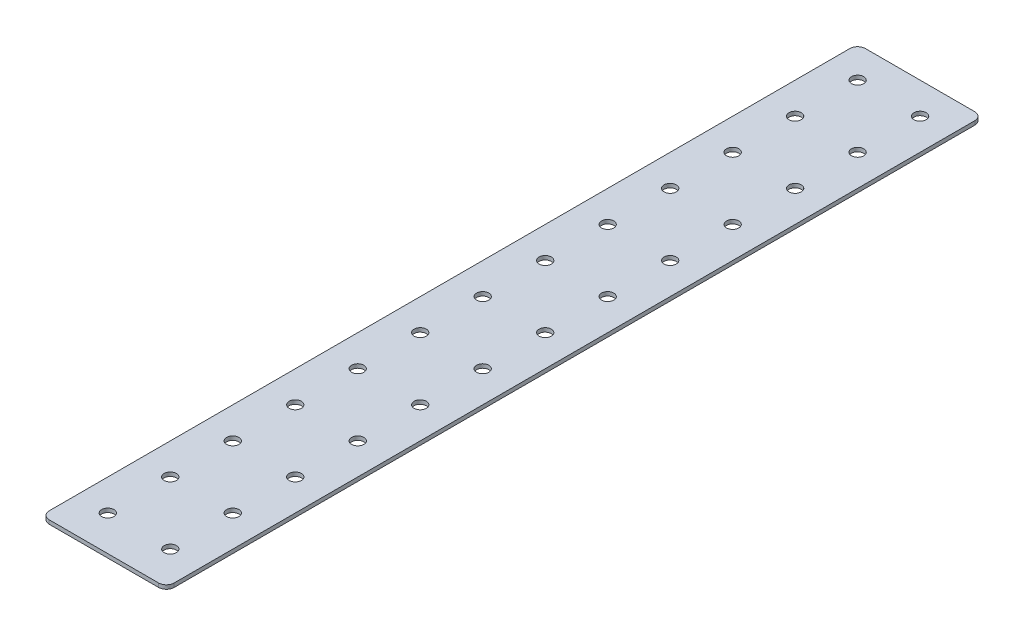
ISO-10303-21;
HEADER;
FILE_DESCRIPTION(('STEP AP214'),'2;1');
FILE_NAME('part.step','',(''),(''),'','','');
FILE_SCHEMA(('AUTOMOTIVE_DESIGN { 1 0 10303 214 1 1 1 1 }'));
ENDSEC;
DATA;
#1=APPLICATION_CONTEXT('core data for automotive mechanical design processes');
#2=APPLICATION_PROTOCOL_DEFINITION('international standard','automotive_design',2000,#1);
#3=PRODUCT_CONTEXT('',#1,'mechanical');
#4=PRODUCT('Part','Part','',(#3));
#5=PRODUCT_RELATED_PRODUCT_CATEGORY('part','',(#4));
#6=PRODUCT_DEFINITION_FORMATION('','',#4);
#7=PRODUCT_DEFINITION_CONTEXT('part definition',#1,'design');
#8=PRODUCT_DEFINITION('design','',#6,#7);
#9=PRODUCT_DEFINITION_SHAPE('','',#8);
#10=(LENGTH_UNIT() NAMED_UNIT(*) SI_UNIT(.MILLI.,.METRE.));
#11=(NAMED_UNIT(*) PLANE_ANGLE_UNIT() SI_UNIT($,.RADIAN.));
#12=(NAMED_UNIT(*) SI_UNIT($,.STERADIAN.) SOLID_ANGLE_UNIT());
#13=UNCERTAINTY_MEASURE_WITH_UNIT(LENGTH_MEASURE(1.E-05),#10,'distance_accuracy_value','');
#14=(GEOMETRIC_REPRESENTATION_CONTEXT(3) GLOBAL_UNCERTAINTY_ASSIGNED_CONTEXT((#13)) GLOBAL_UNIT_ASSIGNED_CONTEXT((#10,
#11,#12)) REPRESENTATION_CONTEXT('',''));
#15=CARTESIAN_POINT('',(0.,0.,0.));
#16=DIRECTION('',(0.,0.,1.));
#17=DIRECTION('',(1.,0.,0.));
#18=AXIS2_PLACEMENT_3D('',#15,#16,#17);
#19=CARTESIAN_POINT('',(0.,1.5875,0.));
#20=DIRECTION('',(0.,-1.,0.));
#21=DIRECTION('',(0.,0.,-1.));
#22=AXIS2_PLACEMENT_3D('',#19,#20,#21);
#23=PLANE('',#22);
#24=DIRECTION('',(-1.,0.,0.));
#25=VECTOR('',#24,1.);
#26=CARTESIAN_POINT('',(0.,1.5875,-331.7875));
#27=LINE('',#26,#25);
#28=CARTESIAN_POINT('',(47.625,1.5875,-331.7875));
#29=VERTEX_POINT('',#28);
#30=CARTESIAN_POINT('',(3.175,1.5875,-331.7875));
#31=VERTEX_POINT('',#30);
#32=EDGE_CURVE('E144',#29,#31,#27,.T.);
#33=ORIENTED_EDGE('',*,*,#32,.T.);
#34=CARTESIAN_POINT('',(3.175,1.5875,-328.6125));
#35=DIRECTION('',(0.,-1.,0.));
#36=DIRECTION('',(0.,0.,-1.));
#37=AXIS2_PLACEMENT_3D('',#34,#35,#36);
#38=CIRCLE('',#37,3.175);
#39=CARTESIAN_POINT('',(0.,1.5875,-328.6125));
#40=VERTEX_POINT('',#39);
#41=EDGE_CURVE('E162',#31,#40,#38,.F.);
#42=ORIENTED_EDGE('',*,*,#41,.T.);
#43=DIRECTION('',(0.,0.,1.));
#44=VECTOR('',#43,1.);
#45=CARTESIAN_POINT('',(0.,1.5875,0.));
#46=LINE('',#45,#44);
#47=CARTESIAN_POINT('',(0.,1.5875,-3.175));
#48=VERTEX_POINT('',#47);
#49=EDGE_CURVE('E126',#40,#48,#46,.T.);
#50=ORIENTED_EDGE('',*,*,#49,.T.);
#51=CARTESIAN_POINT('',(3.175,1.5875,-3.175));
#52=DIRECTION('',(0.,-1.,0.));
#53=DIRECTION('',(0.,0.,-1.));
#54=AXIS2_PLACEMENT_3D('',#51,#52,#53);
#55=CIRCLE('',#54,3.175);
#56=CARTESIAN_POINT('',(3.175,1.5875,0.));
#57=VERTEX_POINT('',#56);
#58=EDGE_CURVE('E158',#48,#57,#55,.F.);
#59=ORIENTED_EDGE('',*,*,#58,.T.);
#60=DIRECTION('',(1.,0.,0.));
#61=VECTOR('',#60,1.);
#62=CARTESIAN_POINT('',(0.,1.5875,0.));
#63=LINE('',#62,#61);
#64=CARTESIAN_POINT('',(47.625,1.5875,0.));
#65=VERTEX_POINT('',#64);
#66=EDGE_CURVE('E171',#57,#65,#63,.T.);
#67=ORIENTED_EDGE('',*,*,#66,.T.);
#68=CARTESIAN_POINT('',(47.625,1.5875,-3.175));
#69=DIRECTION('',(0.,-1.,0.));
#70=DIRECTION('',(0.,0.,-1.));
#71=AXIS2_PLACEMENT_3D('',#68,#69,#70);
#72=CIRCLE('',#71,3.175);
#73=CARTESIAN_POINT('',(50.8,1.5875,-3.175));
#74=VERTEX_POINT('',#73);
#75=EDGE_CURVE('E61',#65,#74,#72,.F.);
#76=ORIENTED_EDGE('',*,*,#75,.T.);
#77=DIRECTION('',(0.,0.,-1.));
#78=VECTOR('',#77,1.);
#79=CARTESIAN_POINT('',(50.8,1.5875,0.));
#80=LINE('',#79,#78);
#81=CARTESIAN_POINT('',(50.8,1.5875,-328.6125));
#82=VERTEX_POINT('',#81);
#83=EDGE_CURVE('E177',#74,#82,#80,.T.);
#84=ORIENTED_EDGE('',*,*,#83,.T.);
#85=CARTESIAN_POINT('',(47.625,1.5875,-328.6125));
#86=DIRECTION('',(0.,-1.,0.));
#87=DIRECTION('',(0.,0.,-1.));
#88=AXIS2_PLACEMENT_3D('',#85,#86,#87);
#89=CIRCLE('',#88,3.175);
#90=EDGE_CURVE('E160',#82,#29,#89,.F.);
#91=ORIENTED_EDGE('',*,*,#90,.T.);
#92=EDGE_LOOP('',(#33,#42,#50,#59,#67,#76,#84,#91));
#93=FACE_BOUND('',#92,.T.);
#94=CARTESIAN_POINT('',(12.7,1.5875,-14.2875));
#95=DIRECTION('',(0.,1.,0.));
#96=DIRECTION('',(0.,0.,1.));
#97=AXIS2_PLACEMENT_3D('',#94,#95,#96);
#98=CIRCLE('',#97,2.4892);
#99=CARTESIAN_POINT('',(12.7,1.5875,-11.7983));
#100=VERTEX_POINT('',#99);
#101=EDGE_CURVE('E135',#100,#100,#98,.T.);
#102=ORIENTED_EDGE('',*,*,#101,.F.);
#103=EDGE_LOOP('',(#102));
#104=FACE_BOUND('',#103,.T.);
#105=CARTESIAN_POINT('',(12.7,1.5875,-166.6875));
#106=DIRECTION('',(0.,1.,0.));
#107=DIRECTION('',(0.,0.,1.));
#108=AXIS2_PLACEMENT_3D('',#105,#106,#107);
#109=CIRCLE('',#108,2.48920000000001);
#110=CARTESIAN_POINT('',(12.7,1.5875,-164.1983));
#111=VERTEX_POINT('',#110);
#112=EDGE_CURVE('E192',#111,#111,#109,.T.);
#113=ORIENTED_EDGE('',*,*,#112,.F.);
#114=EDGE_LOOP('',(#113));
#115=FACE_BOUND('',#114,.T.);
#116=CARTESIAN_POINT('',(12.7,1.5875,-39.6875));
#117=DIRECTION('',(0.,1.,0.));
#118=DIRECTION('',(0.,0.,1.));
#119=AXIS2_PLACEMENT_3D('',#116,#117,#118);
#120=CIRCLE('',#119,2.4892);
#121=CARTESIAN_POINT('',(12.7,1.5875,-37.1983));
#122=VERTEX_POINT('',#121);
#123=EDGE_CURVE('E197',#122,#122,#120,.T.);
#124=ORIENTED_EDGE('',*,*,#123,.F.);
#125=EDGE_LOOP('',(#124));
#126=FACE_BOUND('',#125,.T.);
#127=CARTESIAN_POINT('',(12.7,1.5875,-65.0875));
#128=DIRECTION('',(0.,1.,0.));
#129=DIRECTION('',(0.,0.,1.));
#130=AXIS2_PLACEMENT_3D('',#127,#128,#129);
#131=CIRCLE('',#130,2.4892);
#132=CARTESIAN_POINT('',(12.7,1.5875,-62.5983));
#133=VERTEX_POINT('',#132);
#134=EDGE_CURVE('E203',#133,#133,#131,.T.);
#135=ORIENTED_EDGE('',*,*,#134,.F.);
#136=EDGE_LOOP('',(#135));
#137=FACE_BOUND('',#136,.T.);
#138=CARTESIAN_POINT('',(12.7,1.5875,-90.4875));
#139=DIRECTION('',(0.,1.,0.));
#140=DIRECTION('',(0.,0.,1.));
#141=AXIS2_PLACEMENT_3D('',#138,#139,#140);
#142=CIRCLE('',#141,2.48919999999999);
#143=CARTESIAN_POINT('',(12.7,1.5875,-87.9983));
#144=VERTEX_POINT('',#143);
#145=EDGE_CURVE('E209',#144,#144,#142,.T.);
#146=ORIENTED_EDGE('',*,*,#145,.F.);
#147=EDGE_LOOP('',(#146));
#148=FACE_BOUND('',#147,.T.);
#149=CARTESIAN_POINT('',(12.7,1.5875,-115.8875));
#150=DIRECTION('',(0.,1.,0.));
#151=DIRECTION('',(0.,0.,1.));
#152=AXIS2_PLACEMENT_3D('',#149,#150,#151);
#153=CIRCLE('',#152,2.48919999999999);
#154=CARTESIAN_POINT('',(12.7,1.5875,-113.3983));
#155=VERTEX_POINT('',#154);
#156=EDGE_CURVE('E215',#155,#155,#153,.T.);
#157=ORIENTED_EDGE('',*,*,#156,.F.);
#158=EDGE_LOOP('',(#157));
#159=FACE_BOUND('',#158,.T.);
#160=CARTESIAN_POINT('',(12.7,1.5875,-141.2875));
#161=DIRECTION('',(0.,1.,0.));
#162=DIRECTION('',(0.,0.,1.));
#163=AXIS2_PLACEMENT_3D('',#160,#161,#162);
#164=CIRCLE('',#163,2.48920000000001);
#165=CARTESIAN_POINT('',(12.7,1.5875,-138.7983));
#166=VERTEX_POINT('',#165);
#167=EDGE_CURVE('E221',#166,#166,#164,.T.);
#168=ORIENTED_EDGE('',*,*,#167,.F.);
#169=EDGE_LOOP('',(#168));
#170=FACE_BOUND('',#169,.T.);
#171=CARTESIAN_POINT('',(38.1,1.5875,-39.6875));
#172=DIRECTION('',(0.,1.,0.));
#173=DIRECTION('',(0.,0.,1.));
#174=AXIS2_PLACEMENT_3D('',#171,#172,#173);
#175=CIRCLE('',#174,2.4892);
#176=CARTESIAN_POINT('',(38.1,1.5875,-37.1983));
#177=VERTEX_POINT('',#176);
#178=EDGE_CURVE('E227',#177,#177,#175,.T.);
#179=ORIENTED_EDGE('',*,*,#178,.F.);
#180=EDGE_LOOP('',(#179));
#181=FACE_BOUND('',#180,.T.);
#182=CARTESIAN_POINT('',(38.1,1.5875,-65.0875));
#183=DIRECTION('',(0.,1.,0.));
#184=DIRECTION('',(0.,0.,1.));
#185=AXIS2_PLACEMENT_3D('',#182,#183,#184);
#186=CIRCLE('',#185,2.4892);
#187=CARTESIAN_POINT('',(38.1,1.5875,-62.5983));
#188=VERTEX_POINT('',#187);
#189=EDGE_CURVE('E233',#188,#188,#186,.T.);
#190=ORIENTED_EDGE('',*,*,#189,.F.);
#191=EDGE_LOOP('',(#190));
#192=FACE_BOUND('',#191,.T.);
#193=CARTESIAN_POINT('',(38.1,1.5875,-90.4875));
#194=DIRECTION('',(0.,1.,0.));
#195=DIRECTION('',(0.,0.,1.));
#196=AXIS2_PLACEMENT_3D('',#193,#194,#195);
#197=CIRCLE('',#196,2.4892);
#198=CARTESIAN_POINT('',(38.1,1.5875,-87.9983));
#199=VERTEX_POINT('',#198);
#200=EDGE_CURVE('E239',#199,#199,#197,.T.);
#201=ORIENTED_EDGE('',*,*,#200,.F.);
#202=EDGE_LOOP('',(#201));
#203=FACE_BOUND('',#202,.T.);
#204=CARTESIAN_POINT('',(38.1,1.5875,-115.8875));
#205=DIRECTION('',(0.,1.,0.));
#206=DIRECTION('',(0.,0.,1.));
#207=AXIS2_PLACEMENT_3D('',#204,#205,#206);
#208=CIRCLE('',#207,2.4892);
#209=CARTESIAN_POINT('',(38.1,1.5875,-113.3983));
#210=VERTEX_POINT('',#209);
#211=EDGE_CURVE('E245',#210,#210,#208,.T.);
#212=ORIENTED_EDGE('',*,*,#211,.F.);
#213=EDGE_LOOP('',(#212));
#214=FACE_BOUND('',#213,.T.);
#215=CARTESIAN_POINT('',(38.1,1.5875,-141.2875));
#216=DIRECTION('',(0.,1.,0.));
#217=DIRECTION('',(0.,0.,1.));
#218=AXIS2_PLACEMENT_3D('',#215,#216,#217);
#219=CIRCLE('',#218,2.48920000000001);
#220=CARTESIAN_POINT('',(38.1,1.5875,-138.7983));
#221=VERTEX_POINT('',#220);
#222=EDGE_CURVE('E251',#221,#221,#219,.T.);
#223=ORIENTED_EDGE('',*,*,#222,.F.);
#224=EDGE_LOOP('',(#223));
#225=FACE_BOUND('',#224,.T.);
#226=CARTESIAN_POINT('',(38.1,1.5875,-14.2875));
#227=DIRECTION('',(0.,1.,0.));
#228=DIRECTION('',(0.,0.,1.));
#229=AXIS2_PLACEMENT_3D('',#226,#227,#228);
#230=CIRCLE('',#229,2.4892);
#231=CARTESIAN_POINT('',(38.1,1.5875,-11.7983));
#232=VERTEX_POINT('',#231);
#233=EDGE_CURVE('E257',#232,#232,#230,.T.);
#234=ORIENTED_EDGE('',*,*,#233,.F.);
#235=EDGE_LOOP('',(#234));
#236=FACE_BOUND('',#235,.T.);
#237=CARTESIAN_POINT('',(12.7,1.5875,-319.0875));
#238=DIRECTION('',(0.,1.,0.));
#239=DIRECTION('',(0.,0.,1.));
#240=AXIS2_PLACEMENT_3D('',#237,#238,#239);
#241=CIRCLE('',#240,2.48920000000001);
#242=CARTESIAN_POINT('',(12.7,1.5875,-316.5983));
#243=VERTEX_POINT('',#242);
#244=EDGE_CURVE('E263',#243,#243,#241,.T.);
#245=ORIENTED_EDGE('',*,*,#244,.F.);
#246=EDGE_LOOP('',(#245));
#247=FACE_BOUND('',#246,.T.);
#248=CARTESIAN_POINT('',(38.1,1.5875,-166.6875));
#249=DIRECTION('',(0.,1.,0.));
#250=DIRECTION('',(0.,0.,1.));
#251=AXIS2_PLACEMENT_3D('',#248,#249,#250);
#252=CIRCLE('',#251,2.48920000000001);
#253=CARTESIAN_POINT('',(38.1,1.5875,-164.1983));
#254=VERTEX_POINT('',#253);
#255=EDGE_CURVE('E269',#254,#254,#252,.T.);
#256=ORIENTED_EDGE('',*,*,#255,.F.);
#257=EDGE_LOOP('',(#256));
#258=FACE_BOUND('',#257,.T.);
#259=CARTESIAN_POINT('',(38.1,1.5875,-319.0875));
#260=DIRECTION('',(0.,1.,0.));
#261=DIRECTION('',(0.,0.,1.));
#262=AXIS2_PLACEMENT_3D('',#259,#260,#261);
#263=CIRCLE('',#262,2.48920000000001);
#264=CARTESIAN_POINT('',(38.1,1.5875,-316.5983));
#265=VERTEX_POINT('',#264);
#266=EDGE_CURVE('E275',#265,#265,#263,.T.);
#267=ORIENTED_EDGE('',*,*,#266,.F.);
#268=EDGE_LOOP('',(#267));
#269=FACE_BOUND('',#268,.T.);
#270=CARTESIAN_POINT('',(12.7,1.5875,-293.6875));
#271=DIRECTION('',(0.,1.,0.));
#272=DIRECTION('',(0.,0.,1.));
#273=AXIS2_PLACEMENT_3D('',#270,#271,#272);
#274=CIRCLE('',#273,2.48920000000001);
#275=CARTESIAN_POINT('',(12.7,1.5875,-291.1983));
#276=VERTEX_POINT('',#275);
#277=EDGE_CURVE('E281',#276,#276,#274,.T.);
#278=ORIENTED_EDGE('',*,*,#277,.F.);
#279=EDGE_LOOP('',(#278));
#280=FACE_BOUND('',#279,.T.);
#281=CARTESIAN_POINT('',(38.1,1.5875,-293.6875));
#282=DIRECTION('',(0.,1.,0.));
#283=DIRECTION('',(0.,0.,1.));
#284=AXIS2_PLACEMENT_3D('',#281,#282,#283);
#285=CIRCLE('',#284,2.48920000000001);
#286=CARTESIAN_POINT('',(38.1,1.5875,-291.1983));
#287=VERTEX_POINT('',#286);
#288=EDGE_CURVE('E287',#287,#287,#285,.T.);
#289=ORIENTED_EDGE('',*,*,#288,.F.);
#290=EDGE_LOOP('',(#289));
#291=FACE_BOUND('',#290,.T.);
#292=CARTESIAN_POINT('',(12.7,1.5875,-268.2875));
#293=DIRECTION('',(0.,1.,0.));
#294=DIRECTION('',(0.,0.,1.));
#295=AXIS2_PLACEMENT_3D('',#292,#293,#294);
#296=CIRCLE('',#295,2.48920000000001);
#297=CARTESIAN_POINT('',(12.7,1.5875,-265.7983));
#298=VERTEX_POINT('',#297);
#299=EDGE_CURVE('E293',#298,#298,#296,.T.);
#300=ORIENTED_EDGE('',*,*,#299,.F.);
#301=EDGE_LOOP('',(#300));
#302=FACE_BOUND('',#301,.T.);
#303=CARTESIAN_POINT('',(38.1,1.5875,-268.2875));
#304=DIRECTION('',(0.,1.,0.));
#305=DIRECTION('',(0.,0.,1.));
#306=AXIS2_PLACEMENT_3D('',#303,#304,#305);
#307=CIRCLE('',#306,2.48920000000001);
#308=CARTESIAN_POINT('',(38.1,1.5875,-265.7983));
#309=VERTEX_POINT('',#308);
#310=EDGE_CURVE('E299',#309,#309,#307,.T.);
#311=ORIENTED_EDGE('',*,*,#310,.F.);
#312=EDGE_LOOP('',(#311));
#313=FACE_BOUND('',#312,.T.);
#314=CARTESIAN_POINT('',(12.7,1.5875,-242.8875));
#315=DIRECTION('',(0.,1.,0.));
#316=DIRECTION('',(0.,0.,1.));
#317=AXIS2_PLACEMENT_3D('',#314,#315,#316);
#318=CIRCLE('',#317,2.48920000000001);
#319=CARTESIAN_POINT('',(12.7,1.5875,-240.3983));
#320=VERTEX_POINT('',#319);
#321=EDGE_CURVE('E305',#320,#320,#318,.T.);
#322=ORIENTED_EDGE('',*,*,#321,.F.);
#323=EDGE_LOOP('',(#322));
#324=FACE_BOUND('',#323,.T.);
#325=CARTESIAN_POINT('',(38.1,1.5875,-242.8875));
#326=DIRECTION('',(0.,1.,0.));
#327=DIRECTION('',(0.,0.,1.));
#328=AXIS2_PLACEMENT_3D('',#325,#326,#327);
#329=CIRCLE('',#328,2.48920000000001);
#330=CARTESIAN_POINT('',(38.1,1.5875,-240.3983));
#331=VERTEX_POINT('',#330);
#332=EDGE_CURVE('E311',#331,#331,#329,.T.);
#333=ORIENTED_EDGE('',*,*,#332,.F.);
#334=EDGE_LOOP('',(#333));
#335=FACE_BOUND('',#334,.T.);
#336=CARTESIAN_POINT('',(12.7,1.5875,-217.4875));
#337=DIRECTION('',(0.,1.,0.));
#338=DIRECTION('',(0.,0.,1.));
#339=AXIS2_PLACEMENT_3D('',#336,#337,#338);
#340=CIRCLE('',#339,2.48920000000001);
#341=CARTESIAN_POINT('',(12.7,1.5875,-214.9983));
#342=VERTEX_POINT('',#341);
#343=EDGE_CURVE('E317',#342,#342,#340,.T.);
#344=ORIENTED_EDGE('',*,*,#343,.F.);
#345=EDGE_LOOP('',(#344));
#346=FACE_BOUND('',#345,.T.);
#347=CARTESIAN_POINT('',(38.1,1.5875,-217.4875));
#348=DIRECTION('',(0.,1.,0.));
#349=DIRECTION('',(0.,0.,1.));
#350=AXIS2_PLACEMENT_3D('',#347,#348,#349);
#351=CIRCLE('',#350,2.48920000000001);
#352=CARTESIAN_POINT('',(38.1,1.5875,-214.9983));
#353=VERTEX_POINT('',#352);
#354=EDGE_CURVE('E323',#353,#353,#351,.T.);
#355=ORIENTED_EDGE('',*,*,#354,.F.);
#356=EDGE_LOOP('',(#355));
#357=FACE_BOUND('',#356,.T.);
#358=CARTESIAN_POINT('',(12.7,1.5875,-192.0875));
#359=DIRECTION('',(0.,1.,0.));
#360=DIRECTION('',(0.,0.,1.));
#361=AXIS2_PLACEMENT_3D('',#358,#359,#360);
#362=CIRCLE('',#361,2.48920000000001);
#363=CARTESIAN_POINT('',(12.7,1.5875,-189.5983));
#364=VERTEX_POINT('',#363);
#365=EDGE_CURVE('E329',#364,#364,#362,.T.);
#366=ORIENTED_EDGE('',*,*,#365,.F.);
#367=EDGE_LOOP('',(#366));
#368=FACE_BOUND('',#367,.T.);
#369=CARTESIAN_POINT('',(38.1,1.5875,-192.0875));
#370=DIRECTION('',(0.,1.,0.));
#371=DIRECTION('',(0.,0.,1.));
#372=AXIS2_PLACEMENT_3D('',#369,#370,#371);
#373=CIRCLE('',#372,2.48920000000001);
#374=CARTESIAN_POINT('',(38.1,1.5875,-189.5983));
#375=VERTEX_POINT('',#374);
#376=EDGE_CURVE('E335',#375,#375,#373,.T.);
#377=ORIENTED_EDGE('',*,*,#376,.F.);
#378=EDGE_LOOP('',(#377));
#379=FACE_BOUND('',#378,.T.);
#380=ADVANCED_FACE('F39',(#93,#104,#115,#126,#137,#148,#159,#170,#181,#192,#203,#214,#225,#236,
#247,#258,#269,#280,#291,#302,#313,#324,#335,#346,#357,#368,#379),#23,.F.);
#381=CARTESIAN_POINT('',(0.,0.,0.));
#382=DIRECTION('',(0.,-1.,0.));
#383=DIRECTION('',(0.,0.,-1.));
#384=AXIS2_PLACEMENT_3D('',#381,#382,#383);
#385=PLANE('',#384);
#386=CARTESIAN_POINT('',(12.7,0.,-192.0875));
#387=DIRECTION('',(0.,1.,0.));
#388=DIRECTION('',(0.,0.,1.));
#389=AXIS2_PLACEMENT_3D('',#386,#387,#388);
#390=CIRCLE('',#389,2.48920000000001);
#391=CARTESIAN_POINT('',(12.7,0.,-189.5983));
#392=VERTEX_POINT('',#391);
#393=EDGE_CURVE('E332',#392,#392,#390,.T.);
#394=ORIENTED_EDGE('',*,*,#393,.T.);
#395=EDGE_LOOP('',(#394));
#396=FACE_BOUND('',#395,.T.);
#397=CARTESIAN_POINT('',(12.7,0.,-217.4875));
#398=DIRECTION('',(0.,1.,0.));
#399=DIRECTION('',(0.,0.,1.));
#400=AXIS2_PLACEMENT_3D('',#397,#398,#399);
#401=CIRCLE('',#400,2.48920000000001);
#402=CARTESIAN_POINT('',(12.7,0.,-214.9983));
#403=VERTEX_POINT('',#402);
#404=EDGE_CURVE('E320',#403,#403,#401,.T.);
#405=ORIENTED_EDGE('',*,*,#404,.T.);
#406=EDGE_LOOP('',(#405));
#407=FACE_BOUND('',#406,.T.);
#408=CARTESIAN_POINT('',(12.7,0.,-242.8875));
#409=DIRECTION('',(0.,1.,0.));
#410=DIRECTION('',(0.,0.,1.));
#411=AXIS2_PLACEMENT_3D('',#408,#409,#410);
#412=CIRCLE('',#411,2.48920000000001);
#413=CARTESIAN_POINT('',(12.7,0.,-240.3983));
#414=VERTEX_POINT('',#413);
#415=EDGE_CURVE('E308',#414,#414,#412,.T.);
#416=ORIENTED_EDGE('',*,*,#415,.T.);
#417=EDGE_LOOP('',(#416));
#418=FACE_BOUND('',#417,.T.);
#419=CARTESIAN_POINT('',(12.7,0.,-268.2875));
#420=DIRECTION('',(0.,1.,0.));
#421=DIRECTION('',(0.,0.,1.));
#422=AXIS2_PLACEMENT_3D('',#419,#420,#421);
#423=CIRCLE('',#422,2.48920000000001);
#424=CARTESIAN_POINT('',(12.7,0.,-265.7983));
#425=VERTEX_POINT('',#424);
#426=EDGE_CURVE('E296',#425,#425,#423,.T.);
#427=ORIENTED_EDGE('',*,*,#426,.T.);
#428=EDGE_LOOP('',(#427));
#429=FACE_BOUND('',#428,.T.);
#430=CARTESIAN_POINT('',(12.7,0.,-293.6875));
#431=DIRECTION('',(0.,1.,0.));
#432=DIRECTION('',(0.,0.,1.));
#433=AXIS2_PLACEMENT_3D('',#430,#431,#432);
#434=CIRCLE('',#433,2.48920000000001);
#435=CARTESIAN_POINT('',(12.7,0.,-291.1983));
#436=VERTEX_POINT('',#435);
#437=EDGE_CURVE('E284',#436,#436,#434,.T.);
#438=ORIENTED_EDGE('',*,*,#437,.T.);
#439=EDGE_LOOP('',(#438));
#440=FACE_BOUND('',#439,.T.);
#441=CARTESIAN_POINT('',(38.1,0.,-166.6875));
#442=DIRECTION('',(0.,1.,0.));
#443=DIRECTION('',(0.,0.,1.));
#444=AXIS2_PLACEMENT_3D('',#441,#442,#443);
#445=CIRCLE('',#444,2.48920000000001);
#446=CARTESIAN_POINT('',(38.1,0.,-164.1983));
#447=VERTEX_POINT('',#446);
#448=EDGE_CURVE('E272',#447,#447,#445,.T.);
#449=ORIENTED_EDGE('',*,*,#448,.T.);
#450=EDGE_LOOP('',(#449));
#451=FACE_BOUND('',#450,.T.);
#452=CARTESIAN_POINT('',(38.1,0.,-14.2875));
#453=DIRECTION('',(0.,1.,0.));
#454=DIRECTION('',(0.,0.,1.));
#455=AXIS2_PLACEMENT_3D('',#452,#453,#454);
#456=CIRCLE('',#455,2.4892);
#457=CARTESIAN_POINT('',(38.1,0.,-11.7983));
#458=VERTEX_POINT('',#457);
#459=EDGE_CURVE('E260',#458,#458,#456,.T.);
#460=ORIENTED_EDGE('',*,*,#459,.T.);
#461=EDGE_LOOP('',(#460));
#462=FACE_BOUND('',#461,.T.);
#463=CARTESIAN_POINT('',(38.1,0.,-115.8875));
#464=DIRECTION('',(0.,1.,0.));
#465=DIRECTION('',(0.,0.,1.));
#466=AXIS2_PLACEMENT_3D('',#463,#464,#465);
#467=CIRCLE('',#466,2.4892);
#468=CARTESIAN_POINT('',(38.1,0.,-113.3983));
#469=VERTEX_POINT('',#468);
#470=EDGE_CURVE('E248',#469,#469,#467,.T.);
#471=ORIENTED_EDGE('',*,*,#470,.T.);
#472=EDGE_LOOP('',(#471));
#473=FACE_BOUND('',#472,.T.);
#474=CARTESIAN_POINT('',(38.1,0.,-65.0875));
#475=DIRECTION('',(0.,1.,0.));
#476=DIRECTION('',(0.,0.,1.));
#477=AXIS2_PLACEMENT_3D('',#474,#475,#476);
#478=CIRCLE('',#477,2.4892);
#479=CARTESIAN_POINT('',(38.1,0.,-62.5983));
#480=VERTEX_POINT('',#479);
#481=EDGE_CURVE('E236',#480,#480,#478,.T.);
#482=ORIENTED_EDGE('',*,*,#481,.T.);
#483=EDGE_LOOP('',(#482));
#484=FACE_BOUND('',#483,.T.);
#485=CARTESIAN_POINT('',(12.7,0.,-141.2875));
#486=DIRECTION('',(0.,1.,0.));
#487=DIRECTION('',(0.,0.,1.));
#488=AXIS2_PLACEMENT_3D('',#485,#486,#487);
#489=CIRCLE('',#488,2.48920000000001);
#490=CARTESIAN_POINT('',(12.7,0.,-138.7983));
#491=VERTEX_POINT('',#490);
#492=EDGE_CURVE('E224',#491,#491,#489,.T.);
#493=ORIENTED_EDGE('',*,*,#492,.T.);
#494=EDGE_LOOP('',(#493));
#495=FACE_BOUND('',#494,.T.);
#496=CARTESIAN_POINT('',(12.7,0.,-90.4875));
#497=DIRECTION('',(0.,1.,0.));
#498=DIRECTION('',(0.,0.,1.));
#499=AXIS2_PLACEMENT_3D('',#496,#497,#498);
#500=CIRCLE('',#499,2.48919999999999);
#501=CARTESIAN_POINT('',(12.7,0.,-87.9983));
#502=VERTEX_POINT('',#501);
#503=EDGE_CURVE('E212',#502,#502,#500,.T.);
#504=ORIENTED_EDGE('',*,*,#503,.T.);
#505=EDGE_LOOP('',(#504));
#506=FACE_BOUND('',#505,.T.);
#507=CARTESIAN_POINT('',(12.7,0.,-39.6875));
#508=DIRECTION('',(0.,1.,0.));
#509=DIRECTION('',(0.,0.,1.));
#510=AXIS2_PLACEMENT_3D('',#507,#508,#509);
#511=CIRCLE('',#510,2.4892);
#512=CARTESIAN_POINT('',(12.7,0.,-37.1983));
#513=VERTEX_POINT('',#512);
#514=EDGE_CURVE('E200',#513,#513,#511,.T.);
#515=ORIENTED_EDGE('',*,*,#514,.T.);
#516=EDGE_LOOP('',(#515));
#517=FACE_BOUND('',#516,.T.);
#518=CARTESIAN_POINT('',(12.7,0.,-14.2875));
#519=DIRECTION('',(0.,1.,0.));
#520=DIRECTION('',(0.,0.,1.));
#521=AXIS2_PLACEMENT_3D('',#518,#519,#520);
#522=CIRCLE('',#521,2.4892);
#523=CARTESIAN_POINT('',(12.7,0.,-11.7983));
#524=VERTEX_POINT('',#523);
#525=EDGE_CURVE('E141',#524,#524,#522,.T.);
#526=ORIENTED_EDGE('',*,*,#525,.T.);
#527=EDGE_LOOP('',(#526));
#528=FACE_BOUND('',#527,.T.);
#529=DIRECTION('',(0.,0.,1.));
#530=VECTOR('',#529,1.);
#531=CARTESIAN_POINT('',(0.,0.,0.));
#532=LINE('',#531,#530);
#533=CARTESIAN_POINT('',(0.,0.,-328.6125));
#534=VERTEX_POINT('',#533);
#535=CARTESIAN_POINT('',(0.,0.,-3.175));
#536=VERTEX_POINT('',#535);
#537=EDGE_CURVE('E123',#534,#536,#532,.T.);
#538=ORIENTED_EDGE('',*,*,#537,.F.);
#539=CARTESIAN_POINT('',(3.175,0.,-328.6125));
#540=DIRECTION('',(0.,-1.,0.));
#541=DIRECTION('',(0.,0.,-1.));
#542=AXIS2_PLACEMENT_3D('',#539,#540,#541);
#543=CIRCLE('',#542,3.175);
#544=CARTESIAN_POINT('',(3.175,0.,-331.7875));
#545=VERTEX_POINT('',#544);
#546=EDGE_CURVE('E106',#534,#545,#543,.T.);
#547=ORIENTED_EDGE('',*,*,#546,.T.);
#548=DIRECTION('',(-1.,0.,0.));
#549=VECTOR('',#548,1.);
#550=CARTESIAN_POINT('',(0.,0.,-331.7875));
#551=LINE('',#550,#549);
#552=CARTESIAN_POINT('',(47.625,0.,-331.7875));
#553=VERTEX_POINT('',#552);
#554=EDGE_CURVE('E148',#553,#545,#551,.T.);
#555=ORIENTED_EDGE('',*,*,#554,.F.);
#556=CARTESIAN_POINT('',(47.625,0.,-328.6125));
#557=DIRECTION('',(0.,-1.,0.));
#558=DIRECTION('',(0.,0.,-1.));
#559=AXIS2_PLACEMENT_3D('',#556,#557,#558);
#560=CIRCLE('',#559,3.175);
#561=CARTESIAN_POINT('',(50.8,0.,-328.6125));
#562=VERTEX_POINT('',#561);
#563=EDGE_CURVE('E117',#553,#562,#560,.T.);
#564=ORIENTED_EDGE('',*,*,#563,.T.);
#565=DIRECTION('',(0.,0.,-1.));
#566=VECTOR('',#565,1.);
#567=CARTESIAN_POINT('',(50.8,0.,0.));
#568=LINE('',#567,#566);
#569=CARTESIAN_POINT('',(50.8,0.,-3.175));
#570=VERTEX_POINT('',#569);
#571=EDGE_CURVE('E138',#570,#562,#568,.T.);
#572=ORIENTED_EDGE('',*,*,#571,.F.);
#573=CARTESIAN_POINT('',(47.625,0.,-3.175));
#574=DIRECTION('',(0.,-1.,0.));
#575=DIRECTION('',(0.,0.,-1.));
#576=AXIS2_PLACEMENT_3D('',#573,#574,#575);
#577=CIRCLE('',#576,3.175);
#578=CARTESIAN_POINT('',(47.625,0.,0.));
#579=VERTEX_POINT('',#578);
#580=EDGE_CURVE('E127',#570,#579,#577,.T.);
#581=ORIENTED_EDGE('',*,*,#580,.T.);
#582=DIRECTION('',(1.,0.,0.));
#583=VECTOR('',#582,1.);
#584=CARTESIAN_POINT('',(0.,0.,0.));
#585=LINE('',#584,#583);
#586=CARTESIAN_POINT('',(3.175,0.,0.));
#587=VERTEX_POINT('',#586);
#588=EDGE_CURVE('E134',#587,#579,#585,.T.);
#589=ORIENTED_EDGE('',*,*,#588,.F.);
#590=CARTESIAN_POINT('',(3.175,0.,-3.175));
#591=DIRECTION('',(0.,-1.,0.));
#592=DIRECTION('',(0.,0.,-1.));
#593=AXIS2_PLACEMENT_3D('',#590,#591,#592);
#594=CIRCLE('',#593,3.175);
#595=EDGE_CURVE('E133',#587,#536,#594,.T.);
#596=ORIENTED_EDGE('',*,*,#595,.T.);
#597=EDGE_LOOP('',(#538,#547,#555,#564,#572,#581,#589,#596));
#598=FACE_BOUND('',#597,.T.);
#599=CARTESIAN_POINT('',(12.7,0.,-166.6875));
#600=DIRECTION('',(0.,1.,0.));
#601=DIRECTION('',(0.,0.,1.));
#602=AXIS2_PLACEMENT_3D('',#599,#600,#601);
#603=CIRCLE('',#602,2.48920000000001);
#604=CARTESIAN_POINT('',(12.7,0.,-164.1983));
#605=VERTEX_POINT('',#604);
#606=EDGE_CURVE('E194',#605,#605,#603,.T.);
#607=ORIENTED_EDGE('',*,*,#606,.T.);
#608=EDGE_LOOP('',(#607));
#609=FACE_BOUND('',#608,.T.);
#610=CARTESIAN_POINT('',(12.7,0.,-65.0875));
#611=DIRECTION('',(0.,1.,0.));
#612=DIRECTION('',(0.,0.,1.));
#613=AXIS2_PLACEMENT_3D('',#610,#611,#612);
#614=CIRCLE('',#613,2.4892);
#615=CARTESIAN_POINT('',(12.7,0.,-62.5983));
#616=VERTEX_POINT('',#615);
#617=EDGE_CURVE('E206',#616,#616,#614,.T.);
#618=ORIENTED_EDGE('',*,*,#617,.T.);
#619=EDGE_LOOP('',(#618));
#620=FACE_BOUND('',#619,.T.);
#621=CARTESIAN_POINT('',(12.7,0.,-115.8875));
#622=DIRECTION('',(0.,1.,0.));
#623=DIRECTION('',(0.,0.,1.));
#624=AXIS2_PLACEMENT_3D('',#621,#622,#623);
#625=CIRCLE('',#624,2.48919999999999);
#626=CARTESIAN_POINT('',(12.7,0.,-113.3983));
#627=VERTEX_POINT('',#626);
#628=EDGE_CURVE('E218',#627,#627,#625,.T.);
#629=ORIENTED_EDGE('',*,*,#628,.T.);
#630=EDGE_LOOP('',(#629));
#631=FACE_BOUND('',#630,.T.);
#632=CARTESIAN_POINT('',(38.1,0.,-39.6875));
#633=DIRECTION('',(0.,1.,0.));
#634=DIRECTION('',(0.,0.,1.));
#635=AXIS2_PLACEMENT_3D('',#632,#633,#634);
#636=CIRCLE('',#635,2.4892);
#637=CARTESIAN_POINT('',(38.1,0.,-37.1983));
#638=VERTEX_POINT('',#637);
#639=EDGE_CURVE('E230',#638,#638,#636,.T.);
#640=ORIENTED_EDGE('',*,*,#639,.T.);
#641=EDGE_LOOP('',(#640));
#642=FACE_BOUND('',#641,.T.);
#643=CARTESIAN_POINT('',(38.1,0.,-90.4875));
#644=DIRECTION('',(0.,1.,0.));
#645=DIRECTION('',(0.,0.,1.));
#646=AXIS2_PLACEMENT_3D('',#643,#644,#645);
#647=CIRCLE('',#646,2.4892);
#648=CARTESIAN_POINT('',(38.1,0.,-87.9983));
#649=VERTEX_POINT('',#648);
#650=EDGE_CURVE('E242',#649,#649,#647,.T.);
#651=ORIENTED_EDGE('',*,*,#650,.T.);
#652=EDGE_LOOP('',(#651));
#653=FACE_BOUND('',#652,.T.);
#654=CARTESIAN_POINT('',(38.1,0.,-141.2875));
#655=DIRECTION('',(0.,1.,0.));
#656=DIRECTION('',(0.,0.,1.));
#657=AXIS2_PLACEMENT_3D('',#654,#655,#656);
#658=CIRCLE('',#657,2.48920000000001);
#659=CARTESIAN_POINT('',(38.1,0.,-138.7983));
#660=VERTEX_POINT('',#659);
#661=EDGE_CURVE('E254',#660,#660,#658,.T.);
#662=ORIENTED_EDGE('',*,*,#661,.T.);
#663=EDGE_LOOP('',(#662));
#664=FACE_BOUND('',#663,.T.);
#665=CARTESIAN_POINT('',(12.7,0.,-319.0875));
#666=DIRECTION('',(0.,1.,0.));
#667=DIRECTION('',(0.,0.,1.));
#668=AXIS2_PLACEMENT_3D('',#665,#666,#667);
#669=CIRCLE('',#668,2.48920000000001);
#670=CARTESIAN_POINT('',(12.7,0.,-316.5983));
#671=VERTEX_POINT('',#670);
#672=EDGE_CURVE('E266',#671,#671,#669,.T.);
#673=ORIENTED_EDGE('',*,*,#672,.T.);
#674=EDGE_LOOP('',(#673));
#675=FACE_BOUND('',#674,.T.);
#676=CARTESIAN_POINT('',(38.1,0.,-319.0875));
#677=DIRECTION('',(0.,1.,0.));
#678=DIRECTION('',(0.,0.,1.));
#679=AXIS2_PLACEMENT_3D('',#676,#677,#678);
#680=CIRCLE('',#679,2.48920000000001);
#681=CARTESIAN_POINT('',(38.1,0.,-316.5983));
#682=VERTEX_POINT('',#681);
#683=EDGE_CURVE('E278',#682,#682,#680,.T.);
#684=ORIENTED_EDGE('',*,*,#683,.T.);
#685=EDGE_LOOP('',(#684));
#686=FACE_BOUND('',#685,.T.);
#687=CARTESIAN_POINT('',(38.1,0.,-293.6875));
#688=DIRECTION('',(0.,1.,0.));
#689=DIRECTION('',(0.,0.,1.));
#690=AXIS2_PLACEMENT_3D('',#687,#688,#689);
#691=CIRCLE('',#690,2.48920000000001);
#692=CARTESIAN_POINT('',(38.1,0.,-291.1983));
#693=VERTEX_POINT('',#692);
#694=EDGE_CURVE('E290',#693,#693,#691,.T.);
#695=ORIENTED_EDGE('',*,*,#694,.T.);
#696=EDGE_LOOP('',(#695));
#697=FACE_BOUND('',#696,.T.);
#698=CARTESIAN_POINT('',(38.1,0.,-268.2875));
#699=DIRECTION('',(0.,1.,0.));
#700=DIRECTION('',(0.,0.,1.));
#701=AXIS2_PLACEMENT_3D('',#698,#699,#700);
#702=CIRCLE('',#701,2.48920000000001);
#703=CARTESIAN_POINT('',(38.1,0.,-265.7983));
#704=VERTEX_POINT('',#703);
#705=EDGE_CURVE('E302',#704,#704,#702,.T.);
#706=ORIENTED_EDGE('',*,*,#705,.T.);
#707=EDGE_LOOP('',(#706));
#708=FACE_BOUND('',#707,.T.);
#709=CARTESIAN_POINT('',(38.1,0.,-242.8875));
#710=DIRECTION('',(0.,1.,0.));
#711=DIRECTION('',(0.,0.,1.));
#712=AXIS2_PLACEMENT_3D('',#709,#710,#711);
#713=CIRCLE('',#712,2.48920000000001);
#714=CARTESIAN_POINT('',(38.1,0.,-240.3983));
#715=VERTEX_POINT('',#714);
#716=EDGE_CURVE('E314',#715,#715,#713,.T.);
#717=ORIENTED_EDGE('',*,*,#716,.T.);
#718=EDGE_LOOP('',(#717));
#719=FACE_BOUND('',#718,.T.);
#720=CARTESIAN_POINT('',(38.1,0.,-217.4875));
#721=DIRECTION('',(0.,1.,0.));
#722=DIRECTION('',(0.,0.,1.));
#723=AXIS2_PLACEMENT_3D('',#720,#721,#722);
#724=CIRCLE('',#723,2.48920000000001);
#725=CARTESIAN_POINT('',(38.1,0.,-214.9983));
#726=VERTEX_POINT('',#725);
#727=EDGE_CURVE('E326',#726,#726,#724,.T.);
#728=ORIENTED_EDGE('',*,*,#727,.T.);
#729=EDGE_LOOP('',(#728));
#730=FACE_BOUND('',#729,.T.);
#731=CARTESIAN_POINT('',(38.1,0.,-192.0875));
#732=DIRECTION('',(0.,1.,0.));
#733=DIRECTION('',(0.,0.,1.));
#734=AXIS2_PLACEMENT_3D('',#731,#732,#733);
#735=CIRCLE('',#734,2.48920000000001);
#736=CARTESIAN_POINT('',(38.1,0.,-189.5983));
#737=VERTEX_POINT('',#736);
#738=EDGE_CURVE('E338',#737,#737,#735,.T.);
#739=ORIENTED_EDGE('',*,*,#738,.T.);
#740=EDGE_LOOP('',(#739));
#741=FACE_BOUND('',#740,.T.);
#742=ADVANCED_FACE('F130',(#396,#407,#418,#429,#440,#451,#462,#473,#484,#495,#506,#517,#528,
#598,#609,#620,#631,#642,#653,#664,#675,#686,#697,#708,#719,#730,#741),#385,.T.);
#743=CARTESIAN_POINT('',(0.,1.5875,0.));
#744=DIRECTION('',(1.,0.,0.));
#745=DIRECTION('',(0.,0.,-1.));
#746=AXIS2_PLACEMENT_3D('',#743,#744,#745);
#747=PLANE('',#746);
#748=ORIENTED_EDGE('',*,*,#49,.F.);
#749=DIRECTION('',(0.,-1.,0.));
#750=VECTOR('',#749,1.);
#751=CARTESIAN_POINT('',(0.,1.5875,-328.6125));
#752=LINE('',#751,#750);
#753=EDGE_CURVE('E110',#40,#534,#752,.T.);
#754=ORIENTED_EDGE('',*,*,#753,.T.);
#755=ORIENTED_EDGE('',*,*,#537,.T.);
#756=DIRECTION('',(0.,-1.,0.));
#757=VECTOR('',#756,1.);
#758=CARTESIAN_POINT('',(0.,1.5875,-3.175));
#759=LINE('',#758,#757);
#760=EDGE_CURVE('E128',#536,#48,#759,.F.);
#761=ORIENTED_EDGE('',*,*,#760,.T.);
#762=EDGE_LOOP('',(#748,#754,#755,#761));
#763=FACE_BOUND('',#762,.T.);
#764=ADVANCED_FACE('F122',(#763),#747,.F.);
#765=CARTESIAN_POINT('',(0.,1.5875,0.));
#766=DIRECTION('',(0.,0.,-1.));
#767=DIRECTION('',(-1.,0.,0.));
#768=AXIS2_PLACEMENT_3D('',#765,#766,#767);
#769=PLANE('',#768);
#770=ORIENTED_EDGE('',*,*,#66,.F.);
#771=DIRECTION('',(0.,-1.,0.));
#772=VECTOR('',#771,1.);
#773=CARTESIAN_POINT('',(3.175,1.5875,0.));
#774=LINE('',#773,#772);
#775=EDGE_CURVE('E11',#57,#587,#774,.T.);
#776=ORIENTED_EDGE('',*,*,#775,.T.);
#777=ORIENTED_EDGE('',*,*,#588,.T.);
#778=DIRECTION('',(0.,-1.,0.));
#779=VECTOR('',#778,1.);
#780=CARTESIAN_POINT('',(47.625,1.5875,0.));
#781=LINE('',#780,#779);
#782=EDGE_CURVE('E47',#579,#65,#781,.F.);
#783=ORIENTED_EDGE('',*,*,#782,.T.);
#784=EDGE_LOOP('',(#770,#776,#777,#783));
#785=FACE_BOUND('',#784,.T.);
#786=ADVANCED_FACE('F170',(#785),#769,.F.);
#787=CARTESIAN_POINT('',(50.8,1.5875,0.));
#788=DIRECTION('',(-1.,0.,0.));
#789=DIRECTION('',(0.,0.,1.));
#790=AXIS2_PLACEMENT_3D('',#787,#788,#789);
#791=PLANE('',#790);
#792=ORIENTED_EDGE('',*,*,#571,.T.);
#793=DIRECTION('',(0.,-1.,0.));
#794=VECTOR('',#793,1.);
#795=CARTESIAN_POINT('',(50.8,1.5875,-328.6125));
#796=LINE('',#795,#794);
#797=EDGE_CURVE('E54',#562,#82,#796,.F.);
#798=ORIENTED_EDGE('',*,*,#797,.T.);
#799=ORIENTED_EDGE('',*,*,#83,.F.);
#800=DIRECTION('',(0.,-1.,0.));
#801=VECTOR('',#800,1.);
#802=CARTESIAN_POINT('',(50.8,1.5875,-3.175));
#803=LINE('',#802,#801);
#804=EDGE_CURVE('E164',#74,#570,#803,.T.);
#805=ORIENTED_EDGE('',*,*,#804,.T.);
#806=EDGE_LOOP('',(#792,#798,#799,#805));
#807=FACE_BOUND('',#806,.T.);
#808=ADVANCED_FACE('F181',(#807),#791,.F.);
#809=CARTESIAN_POINT('',(0.,1.5875,-331.7875));
#810=DIRECTION('',(0.,0.,1.));
#811=DIRECTION('',(1.,0.,0.));
#812=AXIS2_PLACEMENT_3D('',#809,#810,#811);
#813=PLANE('',#812);
#814=ORIENTED_EDGE('',*,*,#554,.T.);
#815=DIRECTION('',(0.,-1.,0.));
#816=VECTOR('',#815,1.);
#817=CARTESIAN_POINT('',(3.175,1.5875,-331.7875));
#818=LINE('',#817,#816);
#819=EDGE_CURVE('E111',#545,#31,#818,.F.);
#820=ORIENTED_EDGE('',*,*,#819,.T.);
#821=ORIENTED_EDGE('',*,*,#32,.F.);
#822=DIRECTION('',(0.,-1.,0.));
#823=VECTOR('',#822,1.);
#824=CARTESIAN_POINT('',(47.625,1.5875,-331.7875));
#825=LINE('',#824,#823);
#826=EDGE_CURVE('E116',#29,#553,#825,.T.);
#827=ORIENTED_EDGE('',*,*,#826,.T.);
#828=EDGE_LOOP('',(#814,#820,#821,#827));
#829=FACE_BOUND('',#828,.T.);
#830=ADVANCED_FACE('F188',(#829),#813,.F.);
#831=CARTESIAN_POINT('',(12.7,1.5875,-14.2875));
#832=DIRECTION('',(0.,-1.,0.));
#833=DIRECTION('',(0.,0.,-1.));
#834=AXIS2_PLACEMENT_3D('',#831,#832,#833);
#835=CYLINDRICAL_SURFACE('',#834,2.4892);
#836=ORIENTED_EDGE('',*,*,#101,.T.);
#837=EDGE_LOOP('',(#836));
#838=FACE_BOUND('',#837,.T.);
#839=ORIENTED_EDGE('',*,*,#525,.F.);
#840=EDGE_LOOP('',(#839));
#841=FACE_BOUND('',#840,.T.);
#842=ADVANCED_FACE('F355',(#838,#841),#835,.F.);
#843=CARTESIAN_POINT('',(12.7,1.5875,-166.6875));
#844=DIRECTION('',(0.,-1.,0.));
#845=DIRECTION('',(0.,0.,-1.));
#846=AXIS2_PLACEMENT_3D('',#843,#844,#845);
#847=CYLINDRICAL_SURFACE('',#846,2.48920000000001);
#848=ORIENTED_EDGE('',*,*,#112,.T.);
#849=EDGE_LOOP('',(#848));
#850=FACE_BOUND('',#849,.T.);
#851=ORIENTED_EDGE('',*,*,#606,.F.);
#852=EDGE_LOOP('',(#851));
#853=FACE_BOUND('',#852,.T.);
#854=ADVANCED_FACE('F700',(#850,#853),#847,.F.);
#855=CARTESIAN_POINT('',(12.7,1.5875,-39.6875));
#856=DIRECTION('',(0.,-1.,0.));
#857=DIRECTION('',(0.,0.,-1.));
#858=AXIS2_PLACEMENT_3D('',#855,#856,#857);
#859=CYLINDRICAL_SURFACE('',#858,2.4892);
#860=ORIENTED_EDGE('',*,*,#123,.T.);
#861=EDGE_LOOP('',(#860));
#862=FACE_BOUND('',#861,.T.);
#863=ORIENTED_EDGE('',*,*,#514,.F.);
#864=EDGE_LOOP('',(#863));
#865=FACE_BOUND('',#864,.T.);
#866=ADVANCED_FACE('F689',(#862,#865),#859,.F.);
#867=CARTESIAN_POINT('',(12.7,1.5875,-65.0875));
#868=DIRECTION('',(0.,-1.,0.));
#869=DIRECTION('',(0.,0.,-1.));
#870=AXIS2_PLACEMENT_3D('',#867,#868,#869);
#871=CYLINDRICAL_SURFACE('',#870,2.4892);
#872=ORIENTED_EDGE('',*,*,#134,.T.);
#873=EDGE_LOOP('',(#872));
#874=FACE_BOUND('',#873,.T.);
#875=ORIENTED_EDGE('',*,*,#617,.F.);
#876=EDGE_LOOP('',(#875));
#877=FACE_BOUND('',#876,.T.);
#878=ADVANCED_FACE('F678',(#874,#877),#871,.F.);
#879=CARTESIAN_POINT('',(12.7,1.5875,-90.4875));
#880=DIRECTION('',(0.,-1.,0.));
#881=DIRECTION('',(0.,0.,-1.));
#882=AXIS2_PLACEMENT_3D('',#879,#880,#881);
#883=CYLINDRICAL_SURFACE('',#882,2.48919999999999);
#884=ORIENTED_EDGE('',*,*,#145,.T.);
#885=EDGE_LOOP('',(#884));
#886=FACE_BOUND('',#885,.T.);
#887=ORIENTED_EDGE('',*,*,#503,.F.);
#888=EDGE_LOOP('',(#887));
#889=FACE_BOUND('',#888,.T.);
#890=ADVANCED_FACE('F667',(#886,#889),#883,.F.);
#891=CARTESIAN_POINT('',(12.7,1.5875,-115.8875));
#892=DIRECTION('',(0.,-1.,0.));
#893=DIRECTION('',(0.,0.,-1.));
#894=AXIS2_PLACEMENT_3D('',#891,#892,#893);
#895=CYLINDRICAL_SURFACE('',#894,2.48919999999999);
#896=ORIENTED_EDGE('',*,*,#156,.T.);
#897=EDGE_LOOP('',(#896));
#898=FACE_BOUND('',#897,.T.);
#899=ORIENTED_EDGE('',*,*,#628,.F.);
#900=EDGE_LOOP('',(#899));
#901=FACE_BOUND('',#900,.T.);
#902=ADVANCED_FACE('F656',(#898,#901),#895,.F.);
#903=CARTESIAN_POINT('',(12.7,1.5875,-141.2875));
#904=DIRECTION('',(0.,-1.,0.));
#905=DIRECTION('',(0.,0.,-1.));
#906=AXIS2_PLACEMENT_3D('',#903,#904,#905);
#907=CYLINDRICAL_SURFACE('',#906,2.48920000000001);
#908=ORIENTED_EDGE('',*,*,#167,.T.);
#909=EDGE_LOOP('',(#908));
#910=FACE_BOUND('',#909,.T.);
#911=ORIENTED_EDGE('',*,*,#492,.F.);
#912=EDGE_LOOP('',(#911));
#913=FACE_BOUND('',#912,.T.);
#914=ADVANCED_FACE('F645',(#910,#913),#907,.F.);
#915=CARTESIAN_POINT('',(38.1,1.5875,-39.6875));
#916=DIRECTION('',(0.,-1.,0.));
#917=DIRECTION('',(0.,0.,-1.));
#918=AXIS2_PLACEMENT_3D('',#915,#916,#917);
#919=CYLINDRICAL_SURFACE('',#918,2.4892);
#920=ORIENTED_EDGE('',*,*,#178,.T.);
#921=EDGE_LOOP('',(#920));
#922=FACE_BOUND('',#921,.T.);
#923=ORIENTED_EDGE('',*,*,#639,.F.);
#924=EDGE_LOOP('',(#923));
#925=FACE_BOUND('',#924,.T.);
#926=ADVANCED_FACE('F634',(#922,#925),#919,.F.);
#927=CARTESIAN_POINT('',(38.1,1.5875,-65.0875));
#928=DIRECTION('',(0.,-1.,0.));
#929=DIRECTION('',(0.,0.,-1.));
#930=AXIS2_PLACEMENT_3D('',#927,#928,#929);
#931=CYLINDRICAL_SURFACE('',#930,2.4892);
#932=ORIENTED_EDGE('',*,*,#189,.T.);
#933=EDGE_LOOP('',(#932));
#934=FACE_BOUND('',#933,.T.);
#935=ORIENTED_EDGE('',*,*,#481,.F.);
#936=EDGE_LOOP('',(#935));
#937=FACE_BOUND('',#936,.T.);
#938=ADVANCED_FACE('F623',(#934,#937),#931,.F.);
#939=CARTESIAN_POINT('',(38.1,1.5875,-90.4875));
#940=DIRECTION('',(0.,-1.,0.));
#941=DIRECTION('',(0.,0.,-1.));
#942=AXIS2_PLACEMENT_3D('',#939,#940,#941);
#943=CYLINDRICAL_SURFACE('',#942,2.4892);
#944=ORIENTED_EDGE('',*,*,#200,.T.);
#945=EDGE_LOOP('',(#944));
#946=FACE_BOUND('',#945,.T.);
#947=ORIENTED_EDGE('',*,*,#650,.F.);
#948=EDGE_LOOP('',(#947));
#949=FACE_BOUND('',#948,.T.);
#950=ADVANCED_FACE('F612',(#946,#949),#943,.F.);
#951=CARTESIAN_POINT('',(38.1,1.5875,-115.8875));
#952=DIRECTION('',(0.,-1.,0.));
#953=DIRECTION('',(0.,0.,-1.));
#954=AXIS2_PLACEMENT_3D('',#951,#952,#953);
#955=CYLINDRICAL_SURFACE('',#954,2.4892);
#956=ORIENTED_EDGE('',*,*,#211,.T.);
#957=EDGE_LOOP('',(#956));
#958=FACE_BOUND('',#957,.T.);
#959=ORIENTED_EDGE('',*,*,#470,.F.);
#960=EDGE_LOOP('',(#959));
#961=FACE_BOUND('',#960,.T.);
#962=ADVANCED_FACE('F601',(#958,#961),#955,.F.);
#963=CARTESIAN_POINT('',(38.1,1.5875,-141.2875));
#964=DIRECTION('',(0.,-1.,0.));
#965=DIRECTION('',(0.,0.,-1.));
#966=AXIS2_PLACEMENT_3D('',#963,#964,#965);
#967=CYLINDRICAL_SURFACE('',#966,2.48920000000001);
#968=ORIENTED_EDGE('',*,*,#222,.T.);
#969=EDGE_LOOP('',(#968));
#970=FACE_BOUND('',#969,.T.);
#971=ORIENTED_EDGE('',*,*,#661,.F.);
#972=EDGE_LOOP('',(#971));
#973=FACE_BOUND('',#972,.T.);
#974=ADVANCED_FACE('F590',(#970,#973),#967,.F.);
#975=CARTESIAN_POINT('',(38.1,1.5875,-14.2875));
#976=DIRECTION('',(0.,-1.,0.));
#977=DIRECTION('',(0.,0.,-1.));
#978=AXIS2_PLACEMENT_3D('',#975,#976,#977);
#979=CYLINDRICAL_SURFACE('',#978,2.4892);
#980=ORIENTED_EDGE('',*,*,#233,.T.);
#981=EDGE_LOOP('',(#980));
#982=FACE_BOUND('',#981,.T.);
#983=ORIENTED_EDGE('',*,*,#459,.F.);
#984=EDGE_LOOP('',(#983));
#985=FACE_BOUND('',#984,.T.);
#986=ADVANCED_FACE('F579',(#982,#985),#979,.F.);
#987=CARTESIAN_POINT('',(12.7,1.5875,-319.0875));
#988=DIRECTION('',(0.,-1.,0.));
#989=DIRECTION('',(0.,0.,-1.));
#990=AXIS2_PLACEMENT_3D('',#987,#988,#989);
#991=CYLINDRICAL_SURFACE('',#990,2.48920000000001);
#992=ORIENTED_EDGE('',*,*,#244,.T.);
#993=EDGE_LOOP('',(#992));
#994=FACE_BOUND('',#993,.T.);
#995=ORIENTED_EDGE('',*,*,#672,.F.);
#996=EDGE_LOOP('',(#995));
#997=FACE_BOUND('',#996,.T.);
#998=ADVANCED_FACE('F568',(#994,#997),#991,.F.);
#999=CARTESIAN_POINT('',(38.1,1.5875,-166.6875));
#1000=DIRECTION('',(0.,-1.,0.));
#1001=DIRECTION('',(0.,0.,-1.));
#1002=AXIS2_PLACEMENT_3D('',#999,#1000,#1001);
#1003=CYLINDRICAL_SURFACE('',#1002,2.48920000000001);
#1004=ORIENTED_EDGE('',*,*,#255,.T.);
#1005=EDGE_LOOP('',(#1004));
#1006=FACE_BOUND('',#1005,.T.);
#1007=ORIENTED_EDGE('',*,*,#448,.F.);
#1008=EDGE_LOOP('',(#1007));
#1009=FACE_BOUND('',#1008,.T.);
#1010=ADVANCED_FACE('F557',(#1006,#1009),#1003,.F.);
#1011=CARTESIAN_POINT('',(38.1,1.5875,-319.0875));
#1012=DIRECTION('',(0.,-1.,0.));
#1013=DIRECTION('',(0.,0.,-1.));
#1014=AXIS2_PLACEMENT_3D('',#1011,#1012,#1013);
#1015=CYLINDRICAL_SURFACE('',#1014,2.48920000000001);
#1016=ORIENTED_EDGE('',*,*,#266,.T.);
#1017=EDGE_LOOP('',(#1016));
#1018=FACE_BOUND('',#1017,.T.);
#1019=ORIENTED_EDGE('',*,*,#683,.F.);
#1020=EDGE_LOOP('',(#1019));
#1021=FACE_BOUND('',#1020,.T.);
#1022=ADVANCED_FACE('F546',(#1018,#1021),#1015,.F.);
#1023=CARTESIAN_POINT('',(12.7,1.5875,-293.6875));
#1024=DIRECTION('',(0.,-1.,0.));
#1025=DIRECTION('',(0.,0.,-1.));
#1026=AXIS2_PLACEMENT_3D('',#1023,#1024,#1025);
#1027=CYLINDRICAL_SURFACE('',#1026,2.48920000000001);
#1028=ORIENTED_EDGE('',*,*,#277,.T.);
#1029=EDGE_LOOP('',(#1028));
#1030=FACE_BOUND('',#1029,.T.);
#1031=ORIENTED_EDGE('',*,*,#437,.F.);
#1032=EDGE_LOOP('',(#1031));
#1033=FACE_BOUND('',#1032,.T.);
#1034=ADVANCED_FACE('F535',(#1030,#1033),#1027,.F.);
#1035=CARTESIAN_POINT('',(38.1,1.5875,-293.6875));
#1036=DIRECTION('',(0.,-1.,0.));
#1037=DIRECTION('',(0.,0.,-1.));
#1038=AXIS2_PLACEMENT_3D('',#1035,#1036,#1037);
#1039=CYLINDRICAL_SURFACE('',#1038,2.48920000000001);
#1040=ORIENTED_EDGE('',*,*,#288,.T.);
#1041=EDGE_LOOP('',(#1040));
#1042=FACE_BOUND('',#1041,.T.);
#1043=ORIENTED_EDGE('',*,*,#694,.F.);
#1044=EDGE_LOOP('',(#1043));
#1045=FACE_BOUND('',#1044,.T.);
#1046=ADVANCED_FACE('F524',(#1042,#1045),#1039,.F.);
#1047=CARTESIAN_POINT('',(12.7,1.5875,-268.2875));
#1048=DIRECTION('',(0.,-1.,0.));
#1049=DIRECTION('',(0.,0.,-1.));
#1050=AXIS2_PLACEMENT_3D('',#1047,#1048,#1049);
#1051=CYLINDRICAL_SURFACE('',#1050,2.48920000000001);
#1052=ORIENTED_EDGE('',*,*,#299,.T.);
#1053=EDGE_LOOP('',(#1052));
#1054=FACE_BOUND('',#1053,.T.);
#1055=ORIENTED_EDGE('',*,*,#426,.F.);
#1056=EDGE_LOOP('',(#1055));
#1057=FACE_BOUND('',#1056,.T.);
#1058=ADVANCED_FACE('F513',(#1054,#1057),#1051,.F.);
#1059=CARTESIAN_POINT('',(38.1,1.5875,-268.2875));
#1060=DIRECTION('',(0.,-1.,0.));
#1061=DIRECTION('',(0.,0.,-1.));
#1062=AXIS2_PLACEMENT_3D('',#1059,#1060,#1061);
#1063=CYLINDRICAL_SURFACE('',#1062,2.48920000000001);
#1064=ORIENTED_EDGE('',*,*,#310,.T.);
#1065=EDGE_LOOP('',(#1064));
#1066=FACE_BOUND('',#1065,.T.);
#1067=ORIENTED_EDGE('',*,*,#705,.F.);
#1068=EDGE_LOOP('',(#1067));
#1069=FACE_BOUND('',#1068,.T.);
#1070=ADVANCED_FACE('F502',(#1066,#1069),#1063,.F.);
#1071=CARTESIAN_POINT('',(12.7,1.5875,-242.8875));
#1072=DIRECTION('',(0.,-1.,0.));
#1073=DIRECTION('',(0.,0.,-1.));
#1074=AXIS2_PLACEMENT_3D('',#1071,#1072,#1073);
#1075=CYLINDRICAL_SURFACE('',#1074,2.48920000000001);
#1076=ORIENTED_EDGE('',*,*,#321,.T.);
#1077=EDGE_LOOP('',(#1076));
#1078=FACE_BOUND('',#1077,.T.);
#1079=ORIENTED_EDGE('',*,*,#415,.F.);
#1080=EDGE_LOOP('',(#1079));
#1081=FACE_BOUND('',#1080,.T.);
#1082=ADVANCED_FACE('F491',(#1078,#1081),#1075,.F.);
#1083=CARTESIAN_POINT('',(38.1,1.5875,-242.8875));
#1084=DIRECTION('',(0.,-1.,0.));
#1085=DIRECTION('',(0.,0.,-1.));
#1086=AXIS2_PLACEMENT_3D('',#1083,#1084,#1085);
#1087=CYLINDRICAL_SURFACE('',#1086,2.48920000000001);
#1088=ORIENTED_EDGE('',*,*,#332,.T.);
#1089=EDGE_LOOP('',(#1088));
#1090=FACE_BOUND('',#1089,.T.);
#1091=ORIENTED_EDGE('',*,*,#716,.F.);
#1092=EDGE_LOOP('',(#1091));
#1093=FACE_BOUND('',#1092,.T.);
#1094=ADVANCED_FACE('F480',(#1090,#1093),#1087,.F.);
#1095=CARTESIAN_POINT('',(12.7,1.5875,-217.4875));
#1096=DIRECTION('',(0.,-1.,0.));
#1097=DIRECTION('',(0.,0.,-1.));
#1098=AXIS2_PLACEMENT_3D('',#1095,#1096,#1097);
#1099=CYLINDRICAL_SURFACE('',#1098,2.48920000000001);
#1100=ORIENTED_EDGE('',*,*,#343,.T.);
#1101=EDGE_LOOP('',(#1100));
#1102=FACE_BOUND('',#1101,.T.);
#1103=ORIENTED_EDGE('',*,*,#404,.F.);
#1104=EDGE_LOOP('',(#1103));
#1105=FACE_BOUND('',#1104,.T.);
#1106=ADVANCED_FACE('F469',(#1102,#1105),#1099,.F.);
#1107=CARTESIAN_POINT('',(38.1,1.5875,-217.4875));
#1108=DIRECTION('',(0.,-1.,0.));
#1109=DIRECTION('',(0.,0.,-1.));
#1110=AXIS2_PLACEMENT_3D('',#1107,#1108,#1109);
#1111=CYLINDRICAL_SURFACE('',#1110,2.48920000000001);
#1112=ORIENTED_EDGE('',*,*,#354,.T.);
#1113=EDGE_LOOP('',(#1112));
#1114=FACE_BOUND('',#1113,.T.);
#1115=ORIENTED_EDGE('',*,*,#727,.F.);
#1116=EDGE_LOOP('',(#1115));
#1117=FACE_BOUND('',#1116,.T.);
#1118=ADVANCED_FACE('F458',(#1114,#1117),#1111,.F.);
#1119=CARTESIAN_POINT('',(12.7,1.5875,-192.0875));
#1120=DIRECTION('',(0.,-1.,0.));
#1121=DIRECTION('',(0.,0.,-1.));
#1122=AXIS2_PLACEMENT_3D('',#1119,#1120,#1121);
#1123=CYLINDRICAL_SURFACE('',#1122,2.48920000000001);
#1124=ORIENTED_EDGE('',*,*,#365,.T.);
#1125=EDGE_LOOP('',(#1124));
#1126=FACE_BOUND('',#1125,.T.);
#1127=ORIENTED_EDGE('',*,*,#393,.F.);
#1128=EDGE_LOOP('',(#1127));
#1129=FACE_BOUND('',#1128,.T.);
#1130=ADVANCED_FACE('F448',(#1126,#1129),#1123,.F.);
#1131=CARTESIAN_POINT('',(38.1,1.5875,-192.0875));
#1132=DIRECTION('',(0.,-1.,0.));
#1133=DIRECTION('',(0.,0.,-1.));
#1134=AXIS2_PLACEMENT_3D('',#1131,#1132,#1133);
#1135=CYLINDRICAL_SURFACE('',#1134,2.48920000000001);
#1136=ORIENTED_EDGE('',*,*,#376,.T.);
#1137=EDGE_LOOP('',(#1136));
#1138=FACE_BOUND('',#1137,.T.);
#1139=ORIENTED_EDGE('',*,*,#738,.F.);
#1140=EDGE_LOOP('',(#1139));
#1141=FACE_BOUND('',#1140,.T.);
#1142=ADVANCED_FACE('F344',(#1138,#1141),#1135,.F.);
#1143=CARTESIAN_POINT('',(3.175,1.5875,-328.6125));
#1144=DIRECTION('',(0.,-1.,0.));
#1145=DIRECTION('',(0.,0.,-1.));
#1146=AXIS2_PLACEMENT_3D('',#1143,#1144,#1145);
#1147=CYLINDRICAL_SURFACE('',#1146,3.175);
#1148=ORIENTED_EDGE('',*,*,#41,.F.);
#1149=ORIENTED_EDGE('',*,*,#819,.F.);
#1150=ORIENTED_EDGE('',*,*,#546,.F.);
#1151=ORIENTED_EDGE('',*,*,#753,.F.);
#1152=EDGE_LOOP('',(#1148,#1149,#1150,#1151));
#1153=FACE_BOUND('',#1152,.T.);
#1154=ADVANCED_FACE('F109',(#1153),#1147,.T.);
#1155=CARTESIAN_POINT('',(47.625,1.5875,-328.6125));
#1156=DIRECTION('',(0.,-1.,0.));
#1157=DIRECTION('',(0.,0.,-1.));
#1158=AXIS2_PLACEMENT_3D('',#1155,#1156,#1157);
#1159=CYLINDRICAL_SURFACE('',#1158,3.175);
#1160=ORIENTED_EDGE('',*,*,#90,.F.);
#1161=ORIENTED_EDGE('',*,*,#797,.F.);
#1162=ORIENTED_EDGE('',*,*,#563,.F.);
#1163=ORIENTED_EDGE('',*,*,#826,.F.);
#1164=EDGE_LOOP('',(#1160,#1161,#1162,#1163));
#1165=FACE_BOUND('',#1164,.T.);
#1166=ADVANCED_FACE('F185',(#1165),#1159,.T.);
#1167=CARTESIAN_POINT('',(3.175,1.5875,-3.175));
#1168=DIRECTION('',(0.,-1.,0.));
#1169=DIRECTION('',(0.,0.,-1.));
#1170=AXIS2_PLACEMENT_3D('',#1167,#1168,#1169);
#1171=CYLINDRICAL_SURFACE('',#1170,3.175);
#1172=ORIENTED_EDGE('',*,*,#58,.F.);
#1173=ORIENTED_EDGE('',*,*,#760,.F.);
#1174=ORIENTED_EDGE('',*,*,#595,.F.);
#1175=ORIENTED_EDGE('',*,*,#775,.F.);
#1176=EDGE_LOOP('',(#1172,#1173,#1174,#1175));
#1177=FACE_BOUND('',#1176,.T.);
#1178=ADVANCED_FACE('F369',(#1177),#1171,.T.);
#1179=CARTESIAN_POINT('',(47.625,1.5875,-3.175));
#1180=DIRECTION('',(0.,-1.,0.));
#1181=DIRECTION('',(0.,0.,-1.));
#1182=AXIS2_PLACEMENT_3D('',#1179,#1180,#1181);
#1183=CYLINDRICAL_SURFACE('',#1182,3.175);
#1184=ORIENTED_EDGE('',*,*,#75,.F.);
#1185=ORIENTED_EDGE('',*,*,#782,.F.);
#1186=ORIENTED_EDGE('',*,*,#580,.F.);
#1187=ORIENTED_EDGE('',*,*,#804,.F.);
#1188=EDGE_LOOP('',(#1184,#1185,#1186,#1187));
#1189=FACE_BOUND('',#1188,.T.);
#1190=ADVANCED_FACE('F41',(#1189),#1183,.T.);
#1191=CLOSED_SHELL('',(#380,#742,#764,#786,#808,#830,#842,#854,#866,#878,#890,#902,#914,#926,
#938,#950,#962,#974,#986,#998,#1010,#1022,#1034,#1046,#1058,#1070,#1082,#1094,#1106,#1118,#1130,
#1142,#1154,#1166,#1178,#1190));
#1192=MANIFOLD_SOLID_BREP('B2',#1191);
#1193=ADVANCED_BREP_SHAPE_REPRESENTATION('',(#18,#1192),#14);
#1194=SHAPE_DEFINITION_REPRESENTATION(#9,#1193);
ENDSEC;
END-ISO-10303-21;
